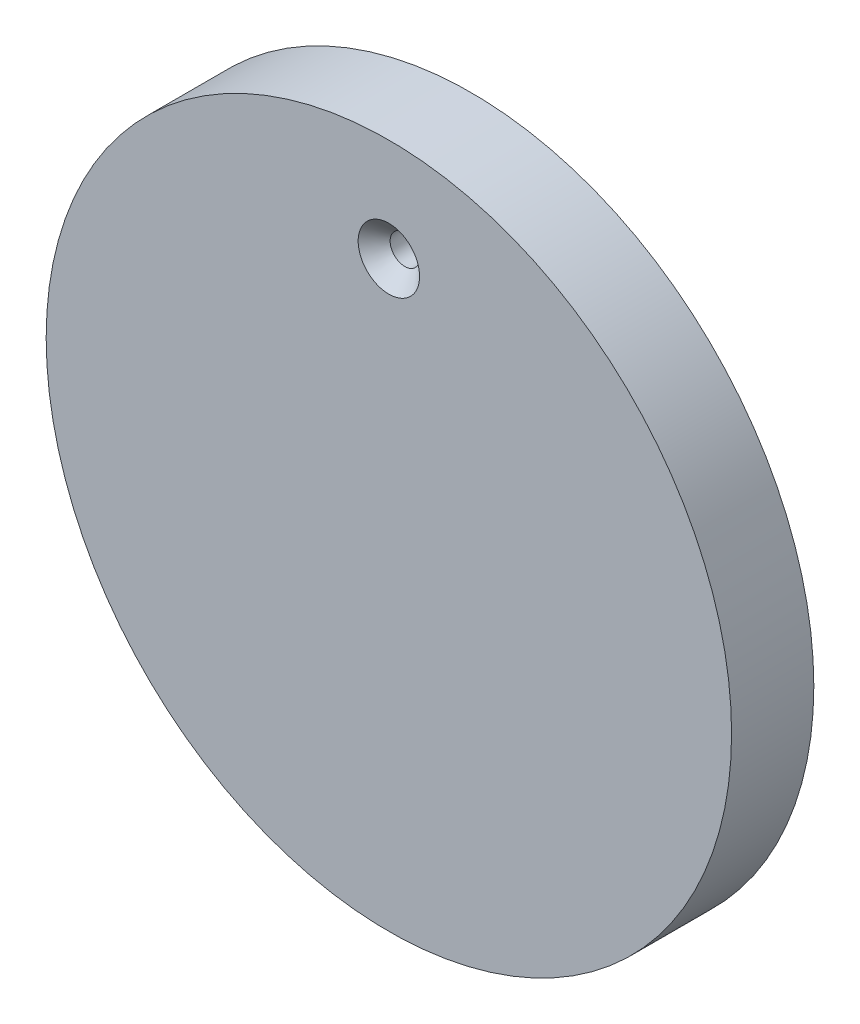
ISO-10303-21;
HEADER;
FILE_DESCRIPTION(('STEP AP214'),'2;1');
FILE_NAME('part.step','',(''),(''),'','','');
FILE_SCHEMA(('AUTOMOTIVE_DESIGN { 1 0 10303 214 1 1 1 1 }'));
ENDSEC;
DATA;
#1=APPLICATION_CONTEXT('core data for automotive mechanical design processes');
#2=APPLICATION_PROTOCOL_DEFINITION('international standard','automotive_design',2000,#1);
#3=PRODUCT_CONTEXT('',#1,'mechanical');
#4=PRODUCT('Part','Part','',(#3));
#5=PRODUCT_RELATED_PRODUCT_CATEGORY('part','',(#4));
#6=PRODUCT_DEFINITION_FORMATION('','',#4);
#7=PRODUCT_DEFINITION_CONTEXT('part definition',#1,'design');
#8=PRODUCT_DEFINITION('design','',#6,#7);
#9=PRODUCT_DEFINITION_SHAPE('','',#8);
#10=(LENGTH_UNIT() NAMED_UNIT(*) SI_UNIT(.MILLI.,.METRE.));
#11=(NAMED_UNIT(*) PLANE_ANGLE_UNIT() SI_UNIT($,.RADIAN.));
#12=(NAMED_UNIT(*) SI_UNIT($,.STERADIAN.) SOLID_ANGLE_UNIT());
#13=UNCERTAINTY_MEASURE_WITH_UNIT(LENGTH_MEASURE(1.E-05),#10,'distance_accuracy_value','');
#14=(GEOMETRIC_REPRESENTATION_CONTEXT(3) GLOBAL_UNCERTAINTY_ASSIGNED_CONTEXT((#13)) GLOBAL_UNIT_ASSIGNED_CONTEXT((#10,
#11,#12)) REPRESENTATION_CONTEXT('',''));
#15=CARTESIAN_POINT('',(0.,0.,0.));
#16=DIRECTION('',(0.,0.,1.));
#17=DIRECTION('',(1.,0.,0.));
#18=AXIS2_PLACEMENT_3D('',#15,#16,#17);
#19=CARTESIAN_POINT('',(0.,0.,12.));
#20=DIRECTION('',(0.,0.,-1.));
#21=DIRECTION('',(-1.,0.,0.));
#22=AXIS2_PLACEMENT_3D('',#19,#20,#21);
#23=CYLINDRICAL_SURFACE('',#22,50.);
#24=CARTESIAN_POINT('',(0.,0.,12.));
#25=DIRECTION('',(0.,0.,1.));
#26=DIRECTION('',(1.,0.,0.));
#27=AXIS2_PLACEMENT_3D('',#24,#25,#26);
#28=CIRCLE('',#27,50.);
#29=CARTESIAN_POINT('',(50.,0.,12.));
#30=VERTEX_POINT('',#29);
#31=EDGE_CURVE('E10',#30,#30,#28,.T.);
#32=ORIENTED_EDGE('',*,*,#31,.F.);
#33=EDGE_LOOP('',(#32));
#34=FACE_BOUND('',#33,.T.);
#35=CARTESIAN_POINT('',(0.,0.,0.));
#36=DIRECTION('',(0.,0.,1.));
#37=DIRECTION('',(1.,0.,0.));
#38=AXIS2_PLACEMENT_3D('',#35,#36,#37);
#39=CIRCLE('',#38,50.);
#40=CARTESIAN_POINT('',(50.,0.,0.));
#41=VERTEX_POINT('',#40);
#42=EDGE_CURVE('E38',#41,#41,#39,.T.);
#43=ORIENTED_EDGE('',*,*,#42,.T.);
#44=EDGE_LOOP('',(#43));
#45=FACE_BOUND('',#44,.T.);
#46=ADVANCED_FACE('F31',(#34,#45),#23,.T.);
#47=CARTESIAN_POINT('',(0.,0.,12.));
#48=DIRECTION('',(0.,0.,1.));
#49=DIRECTION('',(1.,0.,0.));
#50=AXIS2_PLACEMENT_3D('',#47,#48,#49);
#51=PLANE('',#50);
#52=CARTESIAN_POINT('',(0.,35.,12.));
#53=DIRECTION('',(0.,0.,1.));
#54=DIRECTION('',(1.,0.,0.));
#55=AXIS2_PLACEMENT_3D('',#52,#53,#54);
#56=CIRCLE('',#55,4.48);
#57=CARTESIAN_POINT('',(4.48,35.,12.));
#58=VERTEX_POINT('',#57);
#59=EDGE_CURVE('E47',#58,#58,#56,.T.);
#60=ORIENTED_EDGE('',*,*,#59,.F.);
#61=EDGE_LOOP('',(#60));
#62=FACE_BOUND('',#61,.T.);
#63=ORIENTED_EDGE('',*,*,#31,.T.);
#64=EDGE_LOOP('',(#63));
#65=FACE_BOUND('',#64,.T.);
#66=ADVANCED_FACE('F53',(#62,#65),#51,.T.);
#67=CARTESIAN_POINT('',(0.,0.,0.));
#68=DIRECTION('',(0.,0.,1.));
#69=DIRECTION('',(1.,0.,0.));
#70=AXIS2_PLACEMENT_3D('',#67,#68,#69);
#71=PLANE('',#70);
#72=CARTESIAN_POINT('',(0.,35.,0.));
#73=DIRECTION('',(0.,0.,1.));
#74=DIRECTION('',(1.,0.,0.));
#75=AXIS2_PLACEMENT_3D('',#72,#73,#74);
#76=CIRCLE('',#75,2.15);
#77=CARTESIAN_POINT('',(2.15,35.,0.));
#78=VERTEX_POINT('',#77);
#79=EDGE_CURVE('E34',#78,#78,#76,.T.);
#80=ORIENTED_EDGE('',*,*,#79,.T.);
#81=EDGE_LOOP('',(#80));
#82=FACE_BOUND('',#81,.T.);
#83=ORIENTED_EDGE('',*,*,#42,.F.);
#84=EDGE_LOOP('',(#83));
#85=FACE_BOUND('',#84,.T.);
#86=ADVANCED_FACE('F55',(#82,#85),#71,.F.);
#87=CARTESIAN_POINT('',(0.,35.,12.));
#88=DIRECTION('',(0.,0.,1.));
#89=DIRECTION('',(1.,0.,0.));
#90=AXIS2_PLACEMENT_3D('',#87,#88,#89);
#91=CYLINDRICAL_SURFACE('',#90,2.15);
#92=CARTESIAN_POINT('',(0.,35.,9.67));
#93=DIRECTION('',(0.,0.,1.));
#94=DIRECTION('',(1.,0.,0.));
#95=AXIS2_PLACEMENT_3D('',#92,#93,#94);
#96=CIRCLE('',#95,2.15);
#97=CARTESIAN_POINT('',(2.15,35.,9.67));
#98=VERTEX_POINT('',#97);
#99=EDGE_CURVE('E44',#98,#98,#96,.T.);
#100=ORIENTED_EDGE('',*,*,#99,.T.);
#101=EDGE_LOOP('',(#100));
#102=FACE_BOUND('',#101,.T.);
#103=ORIENTED_EDGE('',*,*,#79,.F.);
#104=EDGE_LOOP('',(#103));
#105=FACE_BOUND('',#104,.T.);
#106=ADVANCED_FACE('F61',(#102,#105),#91,.F.);
#107=CARTESIAN_POINT('',(0.,35.,12.));
#108=DIRECTION('',(0.,0.,1.));
#109=DIRECTION('',(1.,0.,0.));
#110=AXIS2_PLACEMENT_3D('',#107,#108,#109);
#111=CONICAL_SURFACE('',#110,4.48,0.785398163397449);
#112=ORIENTED_EDGE('',*,*,#99,.F.);
#113=EDGE_LOOP('',(#112));
#114=FACE_BOUND('',#113,.T.);
#115=ORIENTED_EDGE('',*,*,#59,.T.);
#116=EDGE_LOOP('',(#115));
#117=FACE_BOUND('',#116,.T.);
#118=ADVANCED_FACE('F51',(#114,#117),#111,.F.);
#119=CLOSED_SHELL('',(#46,#66,#86,#106,#118));
#120=MANIFOLD_SOLID_BREP('B2',#119);
#121=ADVANCED_BREP_SHAPE_REPRESENTATION('',(#18,#120),#14);
#122=SHAPE_DEFINITION_REPRESENTATION(#9,#121);
ENDSEC;
END-ISO-10303-21;
